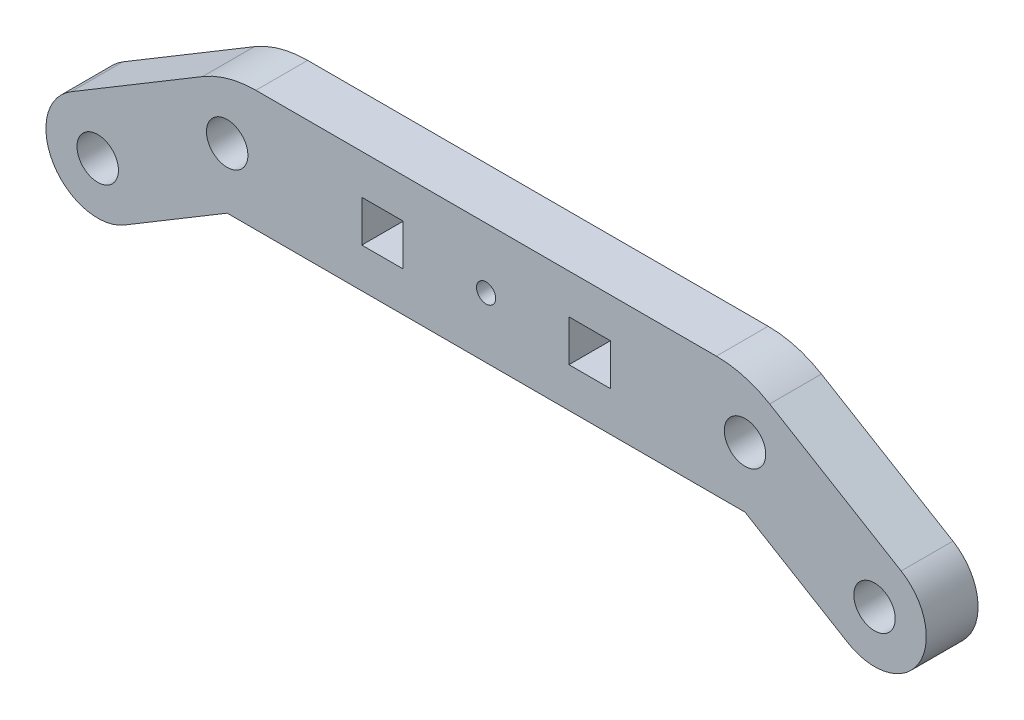
ISO-10303-21;
HEADER;
FILE_DESCRIPTION(('STEP AP214'),'2;1');
FILE_NAME('part.step','',(''),(''),'','','');
FILE_SCHEMA(('AUTOMOTIVE_DESIGN { 1 0 10303 214 1 1 1 1 }'));
ENDSEC;
DATA;
#1=APPLICATION_CONTEXT('core data for automotive mechanical design processes');
#2=APPLICATION_PROTOCOL_DEFINITION('international standard','automotive_design',2000,#1);
#3=PRODUCT_CONTEXT('',#1,'mechanical');
#4=PRODUCT('Part','Part','',(#3));
#5=PRODUCT_RELATED_PRODUCT_CATEGORY('part','',(#4));
#6=PRODUCT_DEFINITION_FORMATION('','',#4);
#7=PRODUCT_DEFINITION_CONTEXT('part definition',#1,'design');
#8=PRODUCT_DEFINITION('design','',#6,#7);
#9=PRODUCT_DEFINITION_SHAPE('','',#8);
#10=(LENGTH_UNIT() NAMED_UNIT(*) SI_UNIT(.MILLI.,.METRE.));
#11=(NAMED_UNIT(*) PLANE_ANGLE_UNIT() SI_UNIT($,.RADIAN.));
#12=(NAMED_UNIT(*) SI_UNIT($,.STERADIAN.) SOLID_ANGLE_UNIT());
#13=UNCERTAINTY_MEASURE_WITH_UNIT(LENGTH_MEASURE(1.E-05),#10,'distance_accuracy_value','');
#14=(GEOMETRIC_REPRESENTATION_CONTEXT(3) GLOBAL_UNCERTAINTY_ASSIGNED_CONTEXT((#13)) GLOBAL_UNIT_ASSIGNED_CONTEXT((#10,
#11,#12)) REPRESENTATION_CONTEXT('',''));
#15=CARTESIAN_POINT('',(0.,0.,0.));
#16=DIRECTION('',(0.,0.,1.));
#17=DIRECTION('',(1.,0.,0.));
#18=AXIS2_PLACEMENT_3D('',#15,#16,#17);
#19=CARTESIAN_POINT('',(-75.,-26.6619037896906,10.));
#20=DIRECTION('',(0.,0.,1.));
#21=DIRECTION('',(1.,0.,0.));
#22=AXIS2_PLACEMENT_3D('',#19,#20,#21);
#23=PLANE('',#22);
#24=CARTESIAN_POINT('',(75.,-26.6619037896905,10.));
#25=DIRECTION('',(0.,0.,1.));
#26=DIRECTION('',(-1.,0.,0.));
#27=AXIS2_PLACEMENT_3D('',#24,#25,#26);
#28=CIRCLE('',#27,4.00000000000001);
#29=CARTESIAN_POINT('',(71.,-26.6619037896905,10.));
#30=VERTEX_POINT('',#29);
#31=EDGE_CURVE('E593',#30,#30,#28,.T.);
#32=ORIENTED_EDGE('',*,*,#31,.F.);
#33=EDGE_LOOP('',(#32));
#34=FACE_BOUND('',#33,.T.);
#35=DIRECTION('',(1.,0.,0.));
#36=VECTOR('',#35,1.);
#37=CARTESIAN_POINT('',(-24.,-15.6619037896906,10.));
#38=LINE('',#37,#36);
#39=CARTESIAN_POINT('',(-24.,-15.6619037896906,10.));
#40=VERTEX_POINT('',#39);
#41=CARTESIAN_POINT('',(-16.,-15.6619037896906,10.));
#42=VERTEX_POINT('',#41);
#43=EDGE_CURVE('E172',#40,#42,#38,.T.);
#44=ORIENTED_EDGE('',*,*,#43,.F.);
#45=DIRECTION('',(0.,-1.,0.));
#46=VECTOR('',#45,1.);
#47=CARTESIAN_POINT('',(-24.,-7.66190378969058,10.));
#48=LINE('',#47,#46);
#49=CARTESIAN_POINT('',(-24.,-7.66190378969058,10.));
#50=VERTEX_POINT('',#49);
#51=EDGE_CURVE('E162',#50,#40,#48,.T.);
#52=ORIENTED_EDGE('',*,*,#51,.F.);
#53=DIRECTION('',(-1.,0.,0.));
#54=VECTOR('',#53,1.);
#55=CARTESIAN_POINT('',(-24.,-7.66190378969058,10.));
#56=LINE('',#55,#54);
#57=CARTESIAN_POINT('',(-16.,-7.66190378969058,10.));
#58=VERTEX_POINT('',#57);
#59=EDGE_CURVE('E188',#58,#50,#56,.T.);
#60=ORIENTED_EDGE('',*,*,#59,.F.);
#61=DIRECTION('',(0.,1.,0.));
#62=VECTOR('',#61,1.);
#63=CARTESIAN_POINT('',(-16.,-7.66190378969058,10.));
#64=LINE('',#63,#62);
#65=EDGE_CURVE('E186',#42,#58,#64,.T.);
#66=ORIENTED_EDGE('',*,*,#65,.F.);
#67=EDGE_LOOP('',(#44,#52,#60,#66));
#68=FACE_BOUND('',#67,.T.);
#69=CARTESIAN_POINT('',(50.,-11.6619037896906,10.));
#70=DIRECTION('',(0.,0.,1.));
#71=DIRECTION('',(-1.,0.,0.));
#72=AXIS2_PLACEMENT_3D('',#69,#70,#71);
#73=CIRCLE('',#72,4.);
#74=CARTESIAN_POINT('',(46.,-11.6619037896906,10.));
#75=VERTEX_POINT('',#74);
#76=EDGE_CURVE('E206',#75,#75,#73,.T.);
#77=ORIENTED_EDGE('',*,*,#76,.F.);
#78=EDGE_LOOP('',(#77));
#79=FACE_BOUND('',#78,.T.);
#80=DIRECTION('',(1.,0.,0.));
#81=VECTOR('',#80,1.);
#82=CARTESIAN_POINT('',(24.,-15.6619037896906,10.));
#83=LINE('',#82,#81);
#84=CARTESIAN_POINT('',(16.,-15.6619037896906,10.));
#85=VERTEX_POINT('',#84);
#86=CARTESIAN_POINT('',(24.,-15.6619037896906,10.));
#87=VERTEX_POINT('',#86);
#88=EDGE_CURVE('E220',#85,#87,#83,.T.);
#89=ORIENTED_EDGE('',*,*,#88,.F.);
#90=DIRECTION('',(0.,-1.,0.));
#91=VECTOR('',#90,1.);
#92=CARTESIAN_POINT('',(16.,-7.66190378969058,10.));
#93=LINE('',#92,#91);
#94=CARTESIAN_POINT('',(16.,-7.66190378969058,10.));
#95=VERTEX_POINT('',#94);
#96=EDGE_CURVE('E218',#95,#85,#93,.T.);
#97=ORIENTED_EDGE('',*,*,#96,.F.);
#98=DIRECTION('',(-1.,0.,0.));
#99=VECTOR('',#98,1.);
#100=CARTESIAN_POINT('',(24.,-7.66190378969058,10.));
#101=LINE('',#100,#99);
#102=CARTESIAN_POINT('',(24.,-7.66190378969057,10.));
#103=VERTEX_POINT('',#102);
#104=EDGE_CURVE('E226',#103,#95,#101,.T.);
#105=ORIENTED_EDGE('',*,*,#104,.F.);
#106=DIRECTION('',(0.,1.,0.));
#107=VECTOR('',#106,1.);
#108=CARTESIAN_POINT('',(24.,-7.66190378969058,10.));
#109=LINE('',#108,#107);
#110=EDGE_CURVE('E223',#87,#103,#109,.T.);
#111=ORIENTED_EDGE('',*,*,#110,.F.);
#112=EDGE_LOOP('',(#89,#97,#105,#111));
#113=FACE_BOUND('',#112,.T.);
#114=DIRECTION('',(-0.857492925712545,0.514495755427525,0.));
#115=VECTOR('',#114,1.);
#116=CARTESIAN_POINT('',(80.1449575542753,-18.0869745325651,10.));
#117=LINE('',#116,#115);
#118=CARTESIAN_POINT('',(80.1449575542753,-18.0869745325651,10.));
#119=VERTEX_POINT('',#118);
#120=CARTESIAN_POINT('',(54.7502358095819,-2.8501414857491,10.));
#121=VERTEX_POINT('',#120);
#122=EDGE_CURVE('E261',#119,#121,#117,.T.);
#123=ORIENTED_EDGE('',*,*,#122,.T.);
#124=CARTESIAN_POINT('',(44.4603207010313,-20.,10.));
#125=DIRECTION('',(0.,0.,1.));
#126=DIRECTION('',(1.,0.,0.));
#127=AXIS2_PLACEMENT_3D('',#124,#125,#126);
#128=CIRCLE('',#127,20.);
#129=CARTESIAN_POINT('',(44.4603207010313,0.,10.));
#130=VERTEX_POINT('',#129);
#131=EDGE_CURVE('E41',#121,#130,#128,.T.);
#132=ORIENTED_EDGE('',*,*,#131,.T.);
#133=DIRECTION('',(-1.,0.,0.));
#134=VECTOR('',#133,1.);
#135=CARTESIAN_POINT('',(50.,0.,10.));
#136=LINE('',#135,#134);
#137=CARTESIAN_POINT('',(-44.4603207010314,0.,10.));
#138=VERTEX_POINT('',#137);
#139=EDGE_CURVE('E263',#130,#138,#136,.T.);
#140=ORIENTED_EDGE('',*,*,#139,.T.);
#141=CARTESIAN_POINT('',(-44.4603207010314,-20.,10.));
#142=DIRECTION('',(0.,0.,1.));
#143=DIRECTION('',(1.,0.,0.));
#144=AXIS2_PLACEMENT_3D('',#141,#142,#143);
#145=CIRCLE('',#144,20.);
#146=CARTESIAN_POINT('',(-54.7502358095819,-2.85014148574911,10.));
#147=VERTEX_POINT('',#146);
#148=EDGE_CURVE('E48',#138,#147,#145,.T.);
#149=ORIENTED_EDGE('',*,*,#148,.T.);
#150=DIRECTION('',(-0.857492925712545,-0.514495755427526,0.));
#151=VECTOR('',#150,1.);
#152=CARTESIAN_POINT('',(-50.,0.,10.));
#153=LINE('',#152,#151);
#154=CARTESIAN_POINT('',(-80.1449575542753,-18.0869745325651,10.));
#155=VERTEX_POINT('',#154);
#156=EDGE_CURVE('E265',#147,#155,#153,.T.);
#157=ORIENTED_EDGE('',*,*,#156,.T.);
#158=CARTESIAN_POINT('',(-75.,-26.6619037896906,10.));
#159=DIRECTION('',(0.,0.,1.));
#160=DIRECTION('',(1.,0.,0.));
#161=AXIS2_PLACEMENT_3D('',#158,#159,#160);
#162=CIRCLE('',#161,10.);
#163=CARTESIAN_POINT('',(-69.8550424457247,-35.236833046816,10.));
#164=VERTEX_POINT('',#163);
#165=EDGE_CURVE('E249',#155,#164,#162,.T.);
#166=ORIENTED_EDGE('',*,*,#165,.T.);
#167=DIRECTION('',(0.857492925712545,0.514495755427526,0.));
#168=VECTOR('',#167,1.);
#169=CARTESIAN_POINT('',(-69.8550424457247,-35.236833046816,10.));
#170=LINE('',#169,#168);
#171=CARTESIAN_POINT('',(-49.9999999999999,-23.3238075793811,10.));
#172=VERTEX_POINT('',#171);
#173=EDGE_CURVE('E252',#164,#172,#170,.T.);
#174=ORIENTED_EDGE('',*,*,#173,.T.);
#175=DIRECTION('',(1.,0.,0.));
#176=VECTOR('',#175,1.);
#177=CARTESIAN_POINT('',(-49.9999999999999,-23.3238075793811,10.));
#178=LINE('',#177,#176);
#179=CARTESIAN_POINT('',(49.9999999999999,-23.3238075793811,10.));
#180=VERTEX_POINT('',#179);
#181=EDGE_CURVE('E255',#172,#180,#178,.T.);
#182=ORIENTED_EDGE('',*,*,#181,.T.);
#183=DIRECTION('',(0.857492925712545,-0.514495755427526,0.));
#184=VECTOR('',#183,1.);
#185=CARTESIAN_POINT('',(49.9999999999999,-23.3238075793811,10.));
#186=LINE('',#185,#184);
#187=CARTESIAN_POINT('',(69.8550424457247,-35.236833046816,10.));
#188=VERTEX_POINT('',#187);
#189=EDGE_CURVE('E257',#180,#188,#186,.T.);
#190=ORIENTED_EDGE('',*,*,#189,.T.);
#191=CARTESIAN_POINT('',(75.,-26.6619037896905,10.));
#192=DIRECTION('',(0.,0.,1.));
#193=DIRECTION('',(-1.,0.,0.));
#194=AXIS2_PLACEMENT_3D('',#191,#192,#193);
#195=CIRCLE('',#194,10.);
#196=EDGE_CURVE('E259',#188,#119,#195,.T.);
#197=ORIENTED_EDGE('',*,*,#196,.T.);
#198=EDGE_LOOP('',(#123,#132,#140,#149,#157,#166,#174,#182,#190,#197));
#199=FACE_BOUND('',#198,.T.);
#200=CARTESIAN_POINT('',(-50.,-11.6619037896906,10.));
#201=DIRECTION('',(0.,0.,1.));
#202=DIRECTION('',(1.,0.,0.));
#203=AXIS2_PLACEMENT_3D('',#200,#201,#202);
#204=CIRCLE('',#203,4.);
#205=CARTESIAN_POINT('',(-46.,-11.6619037896906,10.));
#206=VERTEX_POINT('',#205);
#207=EDGE_CURVE('E212',#206,#206,#204,.T.);
#208=ORIENTED_EDGE('',*,*,#207,.F.);
#209=EDGE_LOOP('',(#208));
#210=FACE_BOUND('',#209,.T.);
#211=CARTESIAN_POINT('',(-75.,-26.6619037896906,10.));
#212=DIRECTION('',(0.,0.,1.));
#213=DIRECTION('',(1.,0.,0.));
#214=AXIS2_PLACEMENT_3D('',#211,#212,#213);
#215=CIRCLE('',#214,4.00000000000001);
#216=CARTESIAN_POINT('',(-71.,-26.6619037896906,10.));
#217=VERTEX_POINT('',#216);
#218=EDGE_CURVE('E195',#217,#217,#215,.T.);
#219=ORIENTED_EDGE('',*,*,#218,.F.);
#220=EDGE_LOOP('',(#219));
#221=FACE_BOUND('',#220,.T.);
#222=CARTESIAN_POINT('',(0.,-11.6619037896906,10.));
#223=DIRECTION('',(0.,0.,1.));
#224=DIRECTION('',(1.,0.,0.));
#225=AXIS2_PLACEMENT_3D('',#222,#223,#224);
#226=CIRCLE('',#225,1.85);
#227=CARTESIAN_POINT('',(1.85,-11.6619037896906,10.));
#228=VERTEX_POINT('',#227);
#229=EDGE_CURVE('E584',#228,#228,#226,.T.);
#230=ORIENTED_EDGE('',*,*,#229,.F.);
#231=EDGE_LOOP('',(#230));
#232=FACE_BOUND('',#231,.T.);
#233=ADVANCED_FACE('F33',(#34,#68,#79,#113,#199,#210,#221,#232),#23,.T.);
#234=CARTESIAN_POINT('',(-75.,-26.6619037896906,0.));
#235=DIRECTION('',(0.,0.,1.));
#236=DIRECTION('',(1.,0.,0.));
#237=AXIS2_PLACEMENT_3D('',#234,#235,#236);
#238=PLANE('',#237);
#239=CARTESIAN_POINT('',(50.,-11.6619037896906,0.));
#240=DIRECTION('',(0.,0.,1.));
#241=DIRECTION('',(-1.,0.,0.));
#242=AXIS2_PLACEMENT_3D('',#239,#240,#241);
#243=CIRCLE('',#242,4.);
#244=CARTESIAN_POINT('',(46.,-11.6619037896906,0.));
#245=VERTEX_POINT('',#244);
#246=EDGE_CURVE('E180',#245,#245,#243,.T.);
#247=ORIENTED_EDGE('',*,*,#246,.T.);
#248=EDGE_LOOP('',(#247));
#249=FACE_BOUND('',#248,.T.);
#250=CARTESIAN_POINT('',(-50.,-11.6619037896906,0.));
#251=DIRECTION('',(0.,0.,1.));
#252=DIRECTION('',(1.,0.,0.));
#253=AXIS2_PLACEMENT_3D('',#250,#251,#252);
#254=CIRCLE('',#253,4.);
#255=CARTESIAN_POINT('',(-46.,-11.6619037896906,0.));
#256=VERTEX_POINT('',#255);
#257=EDGE_CURVE('E209',#256,#256,#254,.T.);
#258=ORIENTED_EDGE('',*,*,#257,.T.);
#259=EDGE_LOOP('',(#258));
#260=FACE_BOUND('',#259,.T.);
#261=DIRECTION('',(0.,-1.,0.));
#262=VECTOR('',#261,1.);
#263=CARTESIAN_POINT('',(16.,-7.66190378969058,0.));
#264=LINE('',#263,#262);
#265=CARTESIAN_POINT('',(16.,-7.66190378969057,0.));
#266=VERTEX_POINT('',#265);
#267=CARTESIAN_POINT('',(16.,-15.6619037896906,0.));
#268=VERTEX_POINT('',#267);
#269=EDGE_CURVE('E215',#266,#268,#264,.T.);
#270=ORIENTED_EDGE('',*,*,#269,.T.);
#271=DIRECTION('',(1.,0.,0.));
#272=VECTOR('',#271,1.);
#273=CARTESIAN_POINT('',(24.,-15.6619037896906,0.));
#274=LINE('',#273,#272);
#275=CARTESIAN_POINT('',(24.,-15.6619037896906,0.));
#276=VERTEX_POINT('',#275);
#277=EDGE_CURVE('E231',#268,#276,#274,.T.);
#278=ORIENTED_EDGE('',*,*,#277,.T.);
#279=DIRECTION('',(0.,1.,0.));
#280=VECTOR('',#279,1.);
#281=CARTESIAN_POINT('',(24.,-7.66190378969058,0.));
#282=LINE('',#281,#280);
#283=CARTESIAN_POINT('',(24.,-7.66190378969058,0.));
#284=VERTEX_POINT('',#283);
#285=EDGE_CURVE('E234',#276,#284,#282,.T.);
#286=ORIENTED_EDGE('',*,*,#285,.T.);
#287=DIRECTION('',(-1.,0.,0.));
#288=VECTOR('',#287,1.);
#289=CARTESIAN_POINT('',(24.,-7.66190378969058,0.));
#290=LINE('',#289,#288);
#291=EDGE_CURVE('E221',#284,#266,#290,.T.);
#292=ORIENTED_EDGE('',*,*,#291,.T.);
#293=EDGE_LOOP('',(#270,#278,#286,#292));
#294=FACE_BOUND('',#293,.T.);
#295=DIRECTION('',(-1.,0.,0.));
#296=VECTOR('',#295,1.);
#297=CARTESIAN_POINT('',(0.,0.,0.));
#298=LINE('',#297,#296);
#299=CARTESIAN_POINT('',(44.4603207010313,0.,0.));
#300=VERTEX_POINT('',#299);
#301=CARTESIAN_POINT('',(-44.4603207010314,0.,0.));
#302=VERTEX_POINT('',#301);
#303=EDGE_CURVE('E280',#300,#302,#298,.T.);
#304=ORIENTED_EDGE('',*,*,#303,.F.);
#305=CARTESIAN_POINT('',(44.4603207010313,-20.,0.));
#306=DIRECTION('',(0.,0.,1.));
#307=DIRECTION('',(1.,0.,0.));
#308=AXIS2_PLACEMENT_3D('',#305,#306,#307);
#309=CIRCLE('',#308,20.);
#310=CARTESIAN_POINT('',(54.7502358095819,-2.8501414857491,0.));
#311=VERTEX_POINT('',#310);
#312=EDGE_CURVE('E308',#300,#311,#309,.F.);
#313=ORIENTED_EDGE('',*,*,#312,.T.);
#314=DIRECTION('',(-0.857492925712545,0.514495755427525,0.));
#315=VECTOR('',#314,1.);
#316=CARTESIAN_POINT('',(80.1449575542753,-18.0869745325651,0.));
#317=LINE('',#316,#315);
#318=CARTESIAN_POINT('',(80.1449575542753,-18.0869745325651,0.));
#319=VERTEX_POINT('',#318);
#320=EDGE_CURVE('E278',#319,#311,#317,.T.);
#321=ORIENTED_EDGE('',*,*,#320,.F.);
#322=CARTESIAN_POINT('',(75.,-26.6619037896905,0.));
#323=DIRECTION('',(0.,0.,1.));
#324=DIRECTION('',(-1.,0.,0.));
#325=AXIS2_PLACEMENT_3D('',#322,#323,#324);
#326=CIRCLE('',#325,10.);
#327=CARTESIAN_POINT('',(69.8550424457247,-35.236833046816,0.));
#328=VERTEX_POINT('',#327);
#329=EDGE_CURVE('E276',#328,#319,#326,.T.);
#330=ORIENTED_EDGE('',*,*,#329,.F.);
#331=DIRECTION('',(0.857492925712545,-0.514495755427526,0.));
#332=VECTOR('',#331,1.);
#333=CARTESIAN_POINT('',(49.9999999999999,-23.3238075793811,0.));
#334=LINE('',#333,#332);
#335=CARTESIAN_POINT('',(49.9999999999999,-23.3238075793811,0.));
#336=VERTEX_POINT('',#335);
#337=EDGE_CURVE('E274',#336,#328,#334,.T.);
#338=ORIENTED_EDGE('',*,*,#337,.F.);
#339=DIRECTION('',(1.,0.,0.));
#340=VECTOR('',#339,1.);
#341=CARTESIAN_POINT('',(-49.9999999999999,-23.3238075793811,0.));
#342=LINE('',#341,#340);
#343=CARTESIAN_POINT('',(-49.9999999999999,-23.3238075793811,0.));
#344=VERTEX_POINT('',#343);
#345=EDGE_CURVE('E272',#344,#336,#342,.T.);
#346=ORIENTED_EDGE('',*,*,#345,.F.);
#347=DIRECTION('',(0.857492925712545,0.514495755427526,0.));
#348=VECTOR('',#347,1.);
#349=CARTESIAN_POINT('',(-69.8550424457247,-35.236833046816,0.));
#350=LINE('',#349,#348);
#351=CARTESIAN_POINT('',(-69.8550424457247,-35.236833046816,0.));
#352=VERTEX_POINT('',#351);
#353=EDGE_CURVE('E270',#352,#344,#350,.T.);
#354=ORIENTED_EDGE('',*,*,#353,.F.);
#355=CARTESIAN_POINT('',(-75.,-26.6619037896906,0.));
#356=DIRECTION('',(0.,0.,1.));
#357=DIRECTION('',(1.,0.,0.));
#358=AXIS2_PLACEMENT_3D('',#355,#356,#357);
#359=CIRCLE('',#358,10.);
#360=CARTESIAN_POINT('',(-80.1449575542753,-18.0869745325651,0.));
#361=VERTEX_POINT('',#360);
#362=EDGE_CURVE('E248',#361,#352,#359,.T.);
#363=ORIENTED_EDGE('',*,*,#362,.F.);
#364=DIRECTION('',(-0.857492925712545,-0.514495755427526,0.));
#365=VECTOR('',#364,1.);
#366=CARTESIAN_POINT('',(-50.,0.,0.));
#367=LINE('',#366,#365);
#368=CARTESIAN_POINT('',(-54.7502358095819,-2.85014148574911,0.));
#369=VERTEX_POINT('',#368);
#370=EDGE_CURVE('E253',#369,#361,#367,.T.);
#371=ORIENTED_EDGE('',*,*,#370,.F.);
#372=CARTESIAN_POINT('',(-44.4603207010314,-20.,0.));
#373=DIRECTION('',(0.,0.,1.));
#374=DIRECTION('',(1.,0.,0.));
#375=AXIS2_PLACEMENT_3D('',#372,#373,#374);
#376=CIRCLE('',#375,20.);
#377=EDGE_CURVE('E306',#369,#302,#376,.F.);
#378=ORIENTED_EDGE('',*,*,#377,.T.);
#379=EDGE_LOOP('',(#304,#313,#321,#330,#338,#346,#354,#363,#371,#378));
#380=FACE_BOUND('',#379,.T.);
#381=DIRECTION('',(0.,-1.,0.));
#382=VECTOR('',#381,1.);
#383=CARTESIAN_POINT('',(-24.,-7.66190378969058,0.));
#384=LINE('',#383,#382);
#385=CARTESIAN_POINT('',(-24.,-7.66190378969058,0.));
#386=VERTEX_POINT('',#385);
#387=CARTESIAN_POINT('',(-24.,-15.6619037896906,0.));
#388=VERTEX_POINT('',#387);
#389=EDGE_CURVE('E193',#386,#388,#384,.T.);
#390=ORIENTED_EDGE('',*,*,#389,.T.);
#391=DIRECTION('',(1.,0.,0.));
#392=VECTOR('',#391,1.);
#393=CARTESIAN_POINT('',(-24.,-15.6619037896906,0.));
#394=LINE('',#393,#392);
#395=CARTESIAN_POINT('',(-16.,-15.6619037896906,0.));
#396=VERTEX_POINT('',#395);
#397=EDGE_CURVE('E179',#388,#396,#394,.T.);
#398=ORIENTED_EDGE('',*,*,#397,.T.);
#399=DIRECTION('',(0.,1.,0.));
#400=VECTOR('',#399,1.);
#401=CARTESIAN_POINT('',(-16.,-7.66190378969058,0.));
#402=LINE('',#401,#400);
#403=CARTESIAN_POINT('',(-16.,-7.66190378969058,0.));
#404=VERTEX_POINT('',#403);
#405=EDGE_CURVE('E197',#396,#404,#402,.T.);
#406=ORIENTED_EDGE('',*,*,#405,.T.);
#407=DIRECTION('',(-1.,0.,0.));
#408=VECTOR('',#407,1.);
#409=CARTESIAN_POINT('',(-24.,-7.66190378969058,0.));
#410=LINE('',#409,#408);
#411=EDGE_CURVE('E173',#404,#386,#410,.T.);
#412=ORIENTED_EDGE('',*,*,#411,.T.);
#413=EDGE_LOOP('',(#390,#398,#406,#412));
#414=FACE_BOUND('',#413,.T.);
#415=CARTESIAN_POINT('',(-75.,-26.6619037896906,0.));
#416=DIRECTION('',(0.,0.,1.));
#417=DIRECTION('',(1.,0.,0.));
#418=AXIS2_PLACEMENT_3D('',#415,#416,#417);
#419=CIRCLE('',#418,4.00000000000001);
#420=CARTESIAN_POINT('',(-71.,-26.6619037896906,0.));
#421=VERTEX_POINT('',#420);
#422=EDGE_CURVE('E596',#421,#421,#419,.T.);
#423=ORIENTED_EDGE('',*,*,#422,.T.);
#424=EDGE_LOOP('',(#423));
#425=FACE_BOUND('',#424,.T.);
#426=CARTESIAN_POINT('',(75.,-26.6619037896905,0.));
#427=DIRECTION('',(0.,0.,1.));
#428=DIRECTION('',(-1.,0.,0.));
#429=AXIS2_PLACEMENT_3D('',#426,#427,#428);
#430=CIRCLE('',#429,4.00000000000001);
#431=CARTESIAN_POINT('',(71.,-26.6619037896905,0.));
#432=VERTEX_POINT('',#431);
#433=EDGE_CURVE('E590',#432,#432,#430,.T.);
#434=ORIENTED_EDGE('',*,*,#433,.T.);
#435=EDGE_LOOP('',(#434));
#436=FACE_BOUND('',#435,.T.);
#437=CARTESIAN_POINT('',(0.,-11.6619037896906,0.));
#438=DIRECTION('',(0.,0.,1.));
#439=DIRECTION('',(1.,0.,0.));
#440=AXIS2_PLACEMENT_3D('',#437,#438,#439);
#441=CIRCLE('',#440,1.85);
#442=CARTESIAN_POINT('',(1.85,-11.6619037896906,0.));
#443=VERTEX_POINT('',#442);
#444=EDGE_CURVE('E587',#443,#443,#441,.T.);
#445=ORIENTED_EDGE('',*,*,#444,.T.);
#446=EDGE_LOOP('',(#445));
#447=FACE_BOUND('',#446,.T.);
#448=ADVANCED_FACE('F323',(#249,#260,#294,#380,#414,#425,#436,#447),#238,.F.);
#449=CARTESIAN_POINT('',(-75.,-26.6619037896906,10.));
#450=DIRECTION('',(0.,0.,-1.));
#451=DIRECTION('',(-1.,0.,0.));
#452=AXIS2_PLACEMENT_3D('',#449,#450,#451);
#453=CYLINDRICAL_SURFACE('',#452,10.);
#454=ORIENTED_EDGE('',*,*,#362,.T.);
#455=DIRECTION('',(0.,0.,-1.));
#456=VECTOR('',#455,1.);
#457=CARTESIAN_POINT('',(-69.8550424457247,-35.236833046816,10.));
#458=LINE('',#457,#456);
#459=EDGE_CURVE('E298',#164,#352,#458,.T.);
#460=ORIENTED_EDGE('',*,*,#459,.F.);
#461=ORIENTED_EDGE('',*,*,#165,.F.);
#462=DIRECTION('',(0.,0.,-1.));
#463=VECTOR('',#462,1.);
#464=CARTESIAN_POINT('',(-80.1449575542753,-18.0869745325651,10.));
#465=LINE('',#464,#463);
#466=EDGE_CURVE('E267',#155,#361,#465,.T.);
#467=ORIENTED_EDGE('',*,*,#466,.T.);
#468=EDGE_LOOP('',(#454,#460,#461,#467));
#469=FACE_BOUND('',#468,.T.);
#470=ADVANCED_FACE('F348',(#469),#453,.T.);
#471=CARTESIAN_POINT('',(-69.8550424457247,-35.236833046816,10.));
#472=DIRECTION('',(-0.514495755427526,0.857492925712545,0.));
#473=DIRECTION('',(-0.857492925712545,-0.514495755427526,0.));
#474=AXIS2_PLACEMENT_3D('',#471,#472,#473);
#475=PLANE('',#474);
#476=ORIENTED_EDGE('',*,*,#353,.T.);
#477=DIRECTION('',(0.,0.,-1.));
#478=VECTOR('',#477,1.);
#479=CARTESIAN_POINT('',(-49.9999999999999,-23.3238075793811,10.));
#480=LINE('',#479,#478);
#481=EDGE_CURVE('E295',#172,#344,#480,.T.);
#482=ORIENTED_EDGE('',*,*,#481,.F.);
#483=ORIENTED_EDGE('',*,*,#173,.F.);
#484=ORIENTED_EDGE('',*,*,#459,.T.);
#485=EDGE_LOOP('',(#476,#482,#483,#484));
#486=FACE_BOUND('',#485,.T.);
#487=ADVANCED_FACE('F343',(#486),#475,.F.);
#488=CARTESIAN_POINT('',(-49.9999999999999,-23.3238075793811,10.));
#489=DIRECTION('',(0.,1.,0.));
#490=DIRECTION('',(-1.,0.,0.));
#491=AXIS2_PLACEMENT_3D('',#488,#489,#490);
#492=PLANE('',#491);
#493=ORIENTED_EDGE('',*,*,#345,.T.);
#494=DIRECTION('',(0.,0.,-1.));
#495=VECTOR('',#494,1.);
#496=CARTESIAN_POINT('',(49.9999999999999,-23.3238075793811,10.));
#497=LINE('',#496,#495);
#498=EDGE_CURVE('E292',#180,#336,#497,.T.);
#499=ORIENTED_EDGE('',*,*,#498,.F.);
#500=ORIENTED_EDGE('',*,*,#181,.F.);
#501=ORIENTED_EDGE('',*,*,#481,.T.);
#502=EDGE_LOOP('',(#493,#499,#500,#501));
#503=FACE_BOUND('',#502,.T.);
#504=ADVANCED_FACE('F340',(#503),#492,.F.);
#505=CARTESIAN_POINT('',(49.9999999999999,-23.3238075793811,10.));
#506=DIRECTION('',(0.514495755427526,0.857492925712545,0.));
#507=DIRECTION('',(-0.857492925712545,0.514495755427526,0.));
#508=AXIS2_PLACEMENT_3D('',#505,#506,#507);
#509=PLANE('',#508);
#510=ORIENTED_EDGE('',*,*,#337,.T.);
#511=DIRECTION('',(0.,0.,-1.));
#512=VECTOR('',#511,1.);
#513=CARTESIAN_POINT('',(69.8550424457247,-35.236833046816,10.));
#514=LINE('',#513,#512);
#515=EDGE_CURVE('E289',#188,#328,#514,.T.);
#516=ORIENTED_EDGE('',*,*,#515,.F.);
#517=ORIENTED_EDGE('',*,*,#189,.F.);
#518=ORIENTED_EDGE('',*,*,#498,.T.);
#519=EDGE_LOOP('',(#510,#516,#517,#518));
#520=FACE_BOUND('',#519,.T.);
#521=ADVANCED_FACE('F335',(#520),#509,.F.);
#522=CARTESIAN_POINT('',(75.,-26.6619037896905,10.));
#523=DIRECTION('',(0.,0.,-1.));
#524=DIRECTION('',(-1.,0.,0.));
#525=AXIS2_PLACEMENT_3D('',#522,#523,#524);
#526=CYLINDRICAL_SURFACE('',#525,10.);
#527=ORIENTED_EDGE('',*,*,#329,.T.);
#528=DIRECTION('',(0.,0.,-1.));
#529=VECTOR('',#528,1.);
#530=CARTESIAN_POINT('',(80.1449575542753,-18.0869745325651,10.));
#531=LINE('',#530,#529);
#532=EDGE_CURVE('E286',#119,#319,#531,.T.);
#533=ORIENTED_EDGE('',*,*,#532,.F.);
#534=ORIENTED_EDGE('',*,*,#196,.F.);
#535=ORIENTED_EDGE('',*,*,#515,.T.);
#536=EDGE_LOOP('',(#527,#533,#534,#535));
#537=FACE_BOUND('',#536,.T.);
#538=ADVANCED_FACE('F330',(#537),#526,.T.);
#539=CARTESIAN_POINT('',(80.1449575542753,-18.0869745325651,10.));
#540=DIRECTION('',(-0.514495755427525,-0.857492925712545,0.));
#541=DIRECTION('',(0.857492925712545,-0.514495755427526,0.));
#542=AXIS2_PLACEMENT_3D('',#539,#540,#541);
#543=PLANE('',#542);
#544=ORIENTED_EDGE('',*,*,#320,.T.);
#545=DIRECTION('',(0.,0.,-1.));
#546=VECTOR('',#545,1.);
#547=CARTESIAN_POINT('',(54.7502358095819,-2.85014148574909,10.));
#548=LINE('',#547,#546);
#549=EDGE_CURVE('E56',#311,#121,#548,.F.);
#550=ORIENTED_EDGE('',*,*,#549,.T.);
#551=ORIENTED_EDGE('',*,*,#122,.F.);
#552=ORIENTED_EDGE('',*,*,#532,.T.);
#553=EDGE_LOOP('',(#544,#550,#551,#552));
#554=FACE_BOUND('',#553,.T.);
#555=ADVANCED_FACE('F326',(#554),#543,.F.);
#556=CARTESIAN_POINT('',(0.,0.,10.));
#557=DIRECTION('',(0.,-1.,0.));
#558=DIRECTION('',(1.,0.,0.));
#559=AXIS2_PLACEMENT_3D('',#556,#557,#558);
#560=PLANE('',#559);
#561=ORIENTED_EDGE('',*,*,#139,.F.);
#562=DIRECTION('',(0.,0.,-1.));
#563=VECTOR('',#562,1.);
#564=CARTESIAN_POINT('',(44.4603207010313,0.,10.));
#565=LINE('',#564,#563);
#566=EDGE_CURVE('E303',#130,#300,#565,.T.);
#567=ORIENTED_EDGE('',*,*,#566,.T.);
#568=ORIENTED_EDGE('',*,*,#303,.T.);
#569=DIRECTION('',(0.,0.,-1.));
#570=VECTOR('',#569,1.);
#571=CARTESIAN_POINT('',(-44.4603207010314,0.,10.));
#572=LINE('',#571,#570);
#573=EDGE_CURVE('E301',#302,#138,#572,.F.);
#574=ORIENTED_EDGE('',*,*,#573,.T.);
#575=EDGE_LOOP('',(#561,#567,#568,#574));
#576=FACE_BOUND('',#575,.T.);
#577=ADVANCED_FACE('F317',(#576),#560,.F.);
#578=CARTESIAN_POINT('',(-50.,0.,10.));
#579=DIRECTION('',(0.514495755427526,-0.857492925712545,0.));
#580=DIRECTION('',(0.857492925712545,0.514495755427526,0.));
#581=AXIS2_PLACEMENT_3D('',#578,#579,#580);
#582=PLANE('',#581);
#583=ORIENTED_EDGE('',*,*,#156,.F.);
#584=DIRECTION('',(0.,0.,-1.));
#585=VECTOR('',#584,1.);
#586=CARTESIAN_POINT('',(-54.7502358095819,-2.85014148574911,10.));
#587=LINE('',#586,#585);
#588=EDGE_CURVE('E11',#147,#369,#587,.T.);
#589=ORIENTED_EDGE('',*,*,#588,.T.);
#590=ORIENTED_EDGE('',*,*,#370,.T.);
#591=ORIENTED_EDGE('',*,*,#466,.F.);
#592=EDGE_LOOP('',(#583,#589,#590,#591));
#593=FACE_BOUND('',#592,.T.);
#594=ADVANCED_FACE('F352',(#593),#582,.F.);
#595=CARTESIAN_POINT('',(16.,-7.66190378969058,10.));
#596=DIRECTION('',(1.,0.,0.));
#597=DIRECTION('',(0.,0.,-1.));
#598=AXIS2_PLACEMENT_3D('',#595,#596,#597);
#599=PLANE('',#598);
#600=ORIENTED_EDGE('',*,*,#269,.F.);
#601=DIRECTION('',(0.,0.,-1.));
#602=VECTOR('',#601,1.);
#603=CARTESIAN_POINT('',(16.,-7.66190378969058,10.));
#604=LINE('',#603,#602);
#605=EDGE_CURVE('E228',#95,#266,#604,.T.);
#606=ORIENTED_EDGE('',*,*,#605,.F.);
#607=ORIENTED_EDGE('',*,*,#96,.T.);
#608=DIRECTION('',(0.,0.,-1.));
#609=VECTOR('',#608,1.);
#610=CARTESIAN_POINT('',(16.,-15.6619037896906,10.));
#611=LINE('',#610,#609);
#612=EDGE_CURVE('E245',#85,#268,#611,.T.);
#613=ORIENTED_EDGE('',*,*,#612,.T.);
#614=EDGE_LOOP('',(#600,#606,#607,#613));
#615=FACE_BOUND('',#614,.T.);
#616=ADVANCED_FACE('F370',(#615),#599,.T.);
#617=CARTESIAN_POINT('',(24.,-15.6619037896906,10.));
#618=DIRECTION('',(0.,1.,0.));
#619=DIRECTION('',(0.,0.,1.));
#620=AXIS2_PLACEMENT_3D('',#617,#618,#619);
#621=PLANE('',#620);
#622=ORIENTED_EDGE('',*,*,#277,.F.);
#623=ORIENTED_EDGE('',*,*,#612,.F.);
#624=ORIENTED_EDGE('',*,*,#88,.T.);
#625=DIRECTION('',(0.,0.,-1.));
#626=VECTOR('',#625,1.);
#627=CARTESIAN_POINT('',(24.,-15.6619037896906,10.));
#628=LINE('',#627,#626);
#629=EDGE_CURVE('E243',#87,#276,#628,.T.);
#630=ORIENTED_EDGE('',*,*,#629,.T.);
#631=EDGE_LOOP('',(#622,#623,#624,#630));
#632=FACE_BOUND('',#631,.T.);
#633=ADVANCED_FACE('F427',(#632),#621,.T.);
#634=CARTESIAN_POINT('',(24.,-7.66190378969058,10.));
#635=DIRECTION('',(-1.,0.,0.));
#636=DIRECTION('',(0.,-1.,0.));
#637=AXIS2_PLACEMENT_3D('',#634,#635,#636);
#638=PLANE('',#637);
#639=ORIENTED_EDGE('',*,*,#285,.F.);
#640=ORIENTED_EDGE('',*,*,#629,.F.);
#641=ORIENTED_EDGE('',*,*,#110,.T.);
#642=DIRECTION('',(0.,0.,-1.));
#643=VECTOR('',#642,1.);
#644=CARTESIAN_POINT('',(24.,-7.66190378969058,10.));
#645=LINE('',#644,#643);
#646=EDGE_CURVE('E241',#103,#284,#645,.T.);
#647=ORIENTED_EDGE('',*,*,#646,.T.);
#648=EDGE_LOOP('',(#639,#640,#641,#647));
#649=FACE_BOUND('',#648,.T.);
#650=ADVANCED_FACE('F434',(#649),#638,.T.);
#651=CARTESIAN_POINT('',(24.,-7.66190378969058,10.));
#652=DIRECTION('',(0.,-1.,0.));
#653=DIRECTION('',(0.,0.,-1.));
#654=AXIS2_PLACEMENT_3D('',#651,#652,#653);
#655=PLANE('',#654);
#656=ORIENTED_EDGE('',*,*,#291,.F.);
#657=ORIENTED_EDGE('',*,*,#646,.F.);
#658=ORIENTED_EDGE('',*,*,#104,.T.);
#659=ORIENTED_EDGE('',*,*,#605,.T.);
#660=EDGE_LOOP('',(#656,#657,#658,#659));
#661=FACE_BOUND('',#660,.T.);
#662=ADVANCED_FACE('F441',(#661),#655,.T.);
#663=CARTESIAN_POINT('',(-50.,-11.6619037896906,10.));
#664=DIRECTION('',(0.,0.,-1.));
#665=DIRECTION('',(-1.,0.,0.));
#666=AXIS2_PLACEMENT_3D('',#663,#664,#665);
#667=CYLINDRICAL_SURFACE('',#666,4.);
#668=ORIENTED_EDGE('',*,*,#207,.T.);
#669=EDGE_LOOP('',(#668));
#670=FACE_BOUND('',#669,.T.);
#671=ORIENTED_EDGE('',*,*,#257,.F.);
#672=EDGE_LOOP('',(#671));
#673=FACE_BOUND('',#672,.T.);
#674=ADVANCED_FACE('F449',(#670,#673),#667,.F.);
#675=CARTESIAN_POINT('',(50.,-11.6619037896906,10.));
#676=DIRECTION('',(0.,0.,-1.));
#677=DIRECTION('',(-1.,0.,0.));
#678=AXIS2_PLACEMENT_3D('',#675,#676,#677);
#679=CYLINDRICAL_SURFACE('',#678,4.);
#680=ORIENTED_EDGE('',*,*,#76,.T.);
#681=EDGE_LOOP('',(#680));
#682=FACE_BOUND('',#681,.T.);
#683=ORIENTED_EDGE('',*,*,#246,.F.);
#684=EDGE_LOOP('',(#683));
#685=FACE_BOUND('',#684,.T.);
#686=ADVANCED_FACE('F457',(#682,#685),#679,.F.);
#687=CARTESIAN_POINT('',(-24.,-7.66190378969058,10.));
#688=DIRECTION('',(1.,0.,0.));
#689=DIRECTION('',(0.,1.,0.));
#690=AXIS2_PLACEMENT_3D('',#687,#688,#689);
#691=PLANE('',#690);
#692=ORIENTED_EDGE('',*,*,#389,.F.);
#693=DIRECTION('',(0.,0.,-1.));
#694=VECTOR('',#693,1.);
#695=CARTESIAN_POINT('',(-24.,-7.66190378969058,10.));
#696=LINE('',#695,#694);
#697=EDGE_CURVE('E168',#50,#386,#696,.T.);
#698=ORIENTED_EDGE('',*,*,#697,.F.);
#699=ORIENTED_EDGE('',*,*,#51,.T.);
#700=DIRECTION('',(0.,0.,-1.));
#701=VECTOR('',#700,1.);
#702=CARTESIAN_POINT('',(-24.,-15.6619037896906,10.));
#703=LINE('',#702,#701);
#704=EDGE_CURVE('E165',#40,#388,#703,.T.);
#705=ORIENTED_EDGE('',*,*,#704,.T.);
#706=EDGE_LOOP('',(#692,#698,#699,#705));
#707=FACE_BOUND('',#706,.T.);
#708=ADVANCED_FACE('F164',(#707),#691,.T.);
#709=CARTESIAN_POINT('',(-24.,-15.6619037896906,10.));
#710=DIRECTION('',(0.,1.,0.));
#711=DIRECTION('',(-1.,0.,0.));
#712=AXIS2_PLACEMENT_3D('',#709,#710,#711);
#713=PLANE('',#712);
#714=ORIENTED_EDGE('',*,*,#397,.F.);
#715=ORIENTED_EDGE('',*,*,#704,.F.);
#716=ORIENTED_EDGE('',*,*,#43,.T.);
#717=DIRECTION('',(0.,0.,-1.));
#718=VECTOR('',#717,1.);
#719=CARTESIAN_POINT('',(-16.,-15.6619037896906,10.));
#720=LINE('',#719,#718);
#721=EDGE_CURVE('E181',#42,#396,#720,.T.);
#722=ORIENTED_EDGE('',*,*,#721,.T.);
#723=EDGE_LOOP('',(#714,#715,#716,#722));
#724=FACE_BOUND('',#723,.T.);
#725=ADVANCED_FACE('F176',(#724),#713,.T.);
#726=CARTESIAN_POINT('',(-16.,-7.66190378969058,10.));
#727=DIRECTION('',(-1.,0.,0.));
#728=DIRECTION('',(0.,-1.,0.));
#729=AXIS2_PLACEMENT_3D('',#726,#727,#728);
#730=PLANE('',#729);
#731=ORIENTED_EDGE('',*,*,#405,.F.);
#732=ORIENTED_EDGE('',*,*,#721,.F.);
#733=ORIENTED_EDGE('',*,*,#65,.T.);
#734=DIRECTION('',(0.,0.,-1.));
#735=VECTOR('',#734,1.);
#736=CARTESIAN_POINT('',(-16.,-7.66190378969058,10.));
#737=LINE('',#736,#735);
#738=EDGE_CURVE('E203',#58,#404,#737,.T.);
#739=ORIENTED_EDGE('',*,*,#738,.T.);
#740=EDGE_LOOP('',(#731,#732,#733,#739));
#741=FACE_BOUND('',#740,.T.);
#742=ADVANCED_FACE('F478',(#741),#730,.T.);
#743=CARTESIAN_POINT('',(-24.,-7.66190378969058,10.));
#744=DIRECTION('',(0.,-1.,0.));
#745=DIRECTION('',(1.,0.,0.));
#746=AXIS2_PLACEMENT_3D('',#743,#744,#745);
#747=PLANE('',#746);
#748=ORIENTED_EDGE('',*,*,#411,.F.);
#749=ORIENTED_EDGE('',*,*,#738,.F.);
#750=ORIENTED_EDGE('',*,*,#59,.T.);
#751=ORIENTED_EDGE('',*,*,#697,.T.);
#752=EDGE_LOOP('',(#748,#749,#750,#751));
#753=FACE_BOUND('',#752,.T.);
#754=ADVANCED_FACE('F485',(#753),#747,.T.);
#755=CARTESIAN_POINT('',(-75.,-26.6619037896906,10.));
#756=DIRECTION('',(0.,0.,-1.));
#757=DIRECTION('',(-1.,0.,0.));
#758=AXIS2_PLACEMENT_3D('',#755,#756,#757);
#759=CYLINDRICAL_SURFACE('',#758,4.00000000000001);
#760=ORIENTED_EDGE('',*,*,#218,.T.);
#761=EDGE_LOOP('',(#760));
#762=FACE_BOUND('',#761,.T.);
#763=ORIENTED_EDGE('',*,*,#422,.F.);
#764=EDGE_LOOP('',(#763));
#765=FACE_BOUND('',#764,.T.);
#766=ADVANCED_FACE('F493',(#762,#765),#759,.F.);
#767=CARTESIAN_POINT('',(75.,-26.6619037896905,10.));
#768=DIRECTION('',(0.,0.,-1.));
#769=DIRECTION('',(-1.,0.,0.));
#770=AXIS2_PLACEMENT_3D('',#767,#768,#769);
#771=CYLINDRICAL_SURFACE('',#770,4.00000000000001);
#772=ORIENTED_EDGE('',*,*,#31,.T.);
#773=EDGE_LOOP('',(#772));
#774=FACE_BOUND('',#773,.T.);
#775=ORIENTED_EDGE('',*,*,#433,.F.);
#776=EDGE_LOOP('',(#775));
#777=FACE_BOUND('',#776,.T.);
#778=ADVANCED_FACE('F501',(#774,#777),#771,.F.);
#779=CARTESIAN_POINT('',(0.,-11.6619037896906,10.));
#780=DIRECTION('',(0.,0.,-1.));
#781=DIRECTION('',(-1.,0.,0.));
#782=AXIS2_PLACEMENT_3D('',#779,#780,#781);
#783=CYLINDRICAL_SURFACE('',#782,1.85);
#784=ORIENTED_EDGE('',*,*,#229,.T.);
#785=EDGE_LOOP('',(#784));
#786=FACE_BOUND('',#785,.T.);
#787=ORIENTED_EDGE('',*,*,#444,.F.);
#788=EDGE_LOOP('',(#787));
#789=FACE_BOUND('',#788,.T.);
#790=ADVANCED_FACE('F359',(#786,#789),#783,.F.);
#791=CARTESIAN_POINT('',(44.4603207010313,-20.,10.));
#792=DIRECTION('',(0.,0.,-1.));
#793=DIRECTION('',(-1.,0.,0.));
#794=AXIS2_PLACEMENT_3D('',#791,#792,#793);
#795=CYLINDRICAL_SURFACE('',#794,20.);
#796=ORIENTED_EDGE('',*,*,#131,.F.);
#797=ORIENTED_EDGE('',*,*,#549,.F.);
#798=ORIENTED_EDGE('',*,*,#312,.F.);
#799=ORIENTED_EDGE('',*,*,#566,.F.);
#800=EDGE_LOOP('',(#796,#797,#798,#799));
#801=FACE_BOUND('',#800,.T.);
#802=ADVANCED_FACE('F320',(#801),#795,.T.);
#803=CARTESIAN_POINT('',(-44.4603207010314,-20.,10.));
#804=DIRECTION('',(0.,0.,-1.));
#805=DIRECTION('',(-1.,0.,0.));
#806=AXIS2_PLACEMENT_3D('',#803,#804,#805);
#807=CYLINDRICAL_SURFACE('',#806,20.);
#808=ORIENTED_EDGE('',*,*,#148,.F.);
#809=ORIENTED_EDGE('',*,*,#573,.F.);
#810=ORIENTED_EDGE('',*,*,#377,.F.);
#811=ORIENTED_EDGE('',*,*,#588,.F.);
#812=EDGE_LOOP('',(#808,#809,#810,#811));
#813=FACE_BOUND('',#812,.T.);
#814=ADVANCED_FACE('F35',(#813),#807,.T.);
#815=CLOSED_SHELL('',(#233,#448,#470,#487,#504,#521,#538,#555,#577,#594,#616,#633,#650,#662,
#674,#686,#708,#725,#742,#754,#766,#778,#790,#802,#814));
#816=MANIFOLD_SOLID_BREP('B2',#815);
#817=ADVANCED_BREP_SHAPE_REPRESENTATION('',(#18,#816),#14);
#818=SHAPE_DEFINITION_REPRESENTATION(#9,#817);
ENDSEC;
END-ISO-10303-21;
